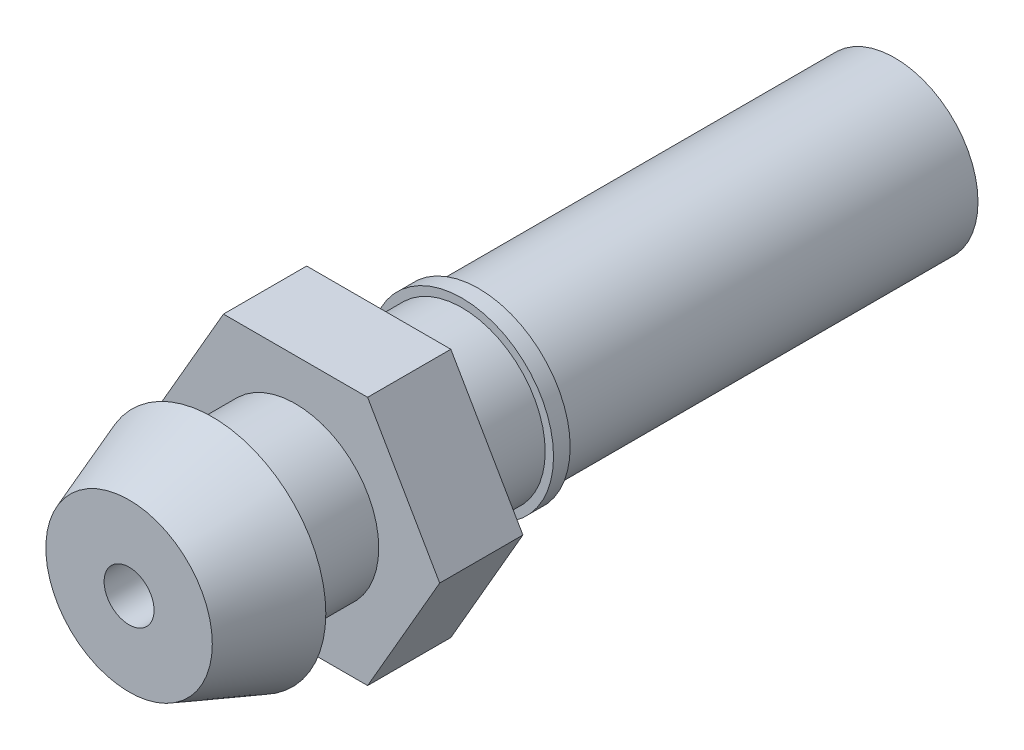
ISO-10303-21;
HEADER;
FILE_DESCRIPTION(('STEP AP214'),'2;1');
FILE_NAME('part.step','',(''),(''),'','','');
FILE_SCHEMA(('AUTOMOTIVE_DESIGN { 1 0 10303 214 1 1 1 1 }'));
ENDSEC;
DATA;
#1=APPLICATION_CONTEXT('core data for automotive mechanical design processes');
#2=APPLICATION_PROTOCOL_DEFINITION('international standard','automotive_design',2000,#1);
#3=PRODUCT_CONTEXT('',#1,'mechanical');
#4=PRODUCT('Part','Part','',(#3));
#5=PRODUCT_RELATED_PRODUCT_CATEGORY('part','',(#4));
#6=PRODUCT_DEFINITION_FORMATION('','',#4);
#7=PRODUCT_DEFINITION_CONTEXT('part definition',#1,'design');
#8=PRODUCT_DEFINITION('design','',#6,#7);
#9=PRODUCT_DEFINITION_SHAPE('','',#8);
#10=(LENGTH_UNIT() NAMED_UNIT(*) SI_UNIT(.MILLI.,.METRE.));
#11=(NAMED_UNIT(*) PLANE_ANGLE_UNIT() SI_UNIT($,.RADIAN.));
#12=(NAMED_UNIT(*) SI_UNIT($,.STERADIAN.) SOLID_ANGLE_UNIT());
#13=UNCERTAINTY_MEASURE_WITH_UNIT(LENGTH_MEASURE(1.E-05),#10,'distance_accuracy_value','');
#14=(GEOMETRIC_REPRESENTATION_CONTEXT(3) GLOBAL_UNCERTAINTY_ASSIGNED_CONTEXT((#13)) GLOBAL_UNIT_ASSIGNED_CONTEXT((#10,
#11,#12)) REPRESENTATION_CONTEXT('',''));
#15=CARTESIAN_POINT('',(0.,0.,0.));
#16=DIRECTION('',(0.,0.,1.));
#17=DIRECTION('',(1.,0.,0.));
#18=AXIS2_PLACEMENT_3D('',#15,#16,#17);
#19=CARTESIAN_POINT('',(0.,0.,11.684));
#20=DIRECTION('',(0.,0.,-1.));
#21=DIRECTION('',(1.,0.,0.));
#22=AXIS2_PLACEMENT_3D('',#19,#20,#21);
#23=CONICAL_SURFACE('',#22,1.27,0.349065850398867);
#24=CARTESIAN_POINT('',(0.,0.,11.684));
#25=DIRECTION('',(0.,0.,1.));
#26=DIRECTION('',(1.,0.,0.));
#27=AXIS2_PLACEMENT_3D('',#24,#25,#26);
#28=CIRCLE('',#27,1.27);
#29=CARTESIAN_POINT('',(1.27,0.,11.684));
#30=VERTEX_POINT('',#29);
#31=EDGE_CURVE('E11',#30,#30,#28,.T.);
#32=ORIENTED_EDGE('',*,*,#31,.F.);
#33=EDGE_LOOP('',(#32));
#34=FACE_BOUND('',#33,.T.);
#35=CARTESIAN_POINT('',(0.,0.,10.414));
#36=DIRECTION('',(0.,0.,1.));
#37=DIRECTION('',(1.,0.,0.));
#38=AXIS2_PLACEMENT_3D('',#35,#36,#37);
#39=CIRCLE('',#38,1.73224219751808);
#40=CARTESIAN_POINT('',(1.73224219751808,0.,10.414));
#41=VERTEX_POINT('',#40);
#42=EDGE_CURVE('E51',#41,#41,#39,.T.);
#43=ORIENTED_EDGE('',*,*,#42,.T.);
#44=EDGE_LOOP('',(#43));
#45=FACE_BOUND('',#44,.T.);
#46=ADVANCED_FACE('F44',(#34,#45),#23,.T.);
#47=CARTESIAN_POINT('',(0.,0.,11.684));
#48=DIRECTION('',(0.,0.,1.));
#49=DIRECTION('',(1.,0.,0.));
#50=AXIS2_PLACEMENT_3D('',#47,#48,#49);
#51=PLANE('',#50);
#52=CARTESIAN_POINT('',(0.,0.,11.684));
#53=DIRECTION('',(0.,0.,1.));
#54=DIRECTION('',(1.,0.,0.));
#55=AXIS2_PLACEMENT_3D('',#52,#53,#54);
#56=CIRCLE('',#55,0.381);
#57=CARTESIAN_POINT('',(0.381,0.,11.684));
#58=VERTEX_POINT('',#57);
#59=EDGE_CURVE('E57',#58,#58,#56,.T.);
#60=ORIENTED_EDGE('',*,*,#59,.F.);
#61=EDGE_LOOP('',(#60));
#62=FACE_BOUND('',#61,.T.);
#63=ORIENTED_EDGE('',*,*,#31,.T.);
#64=EDGE_LOOP('',(#63));
#65=FACE_BOUND('',#64,.T.);
#66=ADVANCED_FACE('F73',(#62,#65),#51,.T.);
#67=CARTESIAN_POINT('',(0.,0.,10.414));
#68=DIRECTION('',(0.,0.,1.));
#69=DIRECTION('',(1.,0.,0.));
#70=AXIS2_PLACEMENT_3D('',#67,#68,#69);
#71=PLANE('',#70);
#72=CARTESIAN_POINT('',(0.,0.,10.414));
#73=DIRECTION('',(0.,0.,1.));
#74=DIRECTION('',(1.,0.,0.));
#75=AXIS2_PLACEMENT_3D('',#72,#73,#74);
#76=CIRCLE('',#75,0.381);
#77=CARTESIAN_POINT('',(0.381,0.,10.414));
#78=VERTEX_POINT('',#77);
#79=EDGE_CURVE('E47',#78,#78,#76,.T.);
#80=ORIENTED_EDGE('',*,*,#79,.T.);
#81=EDGE_LOOP('',(#80));
#82=FACE_BOUND('',#81,.T.);
#83=ORIENTED_EDGE('',*,*,#42,.F.);
#84=EDGE_LOOP('',(#83));
#85=FACE_BOUND('',#84,.T.);
#86=ADVANCED_FACE('F64',(#82,#85),#71,.F.);
#87=CARTESIAN_POINT('',(0.,0.,0.));
#88=DIRECTION('',(0.,0.,1.));
#89=DIRECTION('',(1.,0.,0.));
#90=AXIS2_PLACEMENT_3D('',#87,#88,#89);
#91=CYLINDRICAL_SURFACE('',#90,0.381);
#92=ORIENTED_EDGE('',*,*,#59,.T.);
#93=EDGE_LOOP('',(#92));
#94=FACE_BOUND('',#93,.T.);
#95=ORIENTED_EDGE('',*,*,#79,.F.);
#96=EDGE_LOOP('',(#95));
#97=FACE_BOUND('',#96,.T.);
#98=ADVANCED_FACE('F67',(#94,#97),#91,.F.);
#99=CLOSED_SHELL('',(#46,#66,#86,#98));
#100=MANIFOLD_SOLID_BREP('B2',#99);
#101=CARTESIAN_POINT('',(0.,0.,9.144));
#102=DIRECTION('',(0.,0.,1.));
#103=DIRECTION('',(1.,0.,0.));
#104=AXIS2_PLACEMENT_3D('',#101,#102,#103);
#105=PLANE('',#104);
#106=DIRECTION('',(0.5,0.866025403784439,0.));
#107=VECTOR('',#106,1.);
#108=CARTESIAN_POINT('',(1.09985226280624,-1.905,9.144));
#109=LINE('',#108,#107);
#110=CARTESIAN_POINT('',(1.09985226280624,-1.905,9.144));
#111=VERTEX_POINT('',#110);
#112=CARTESIAN_POINT('',(2.19970452561247,0.,9.144));
#113=VERTEX_POINT('',#112);
#114=EDGE_CURVE('E204',#111,#113,#109,.T.);
#115=ORIENTED_EDGE('',*,*,#114,.T.);
#116=DIRECTION('',(-0.5,0.866025403784439,0.));
#117=VECTOR('',#116,1.);
#118=CARTESIAN_POINT('',(2.19970452561247,0.,9.144));
#119=LINE('',#118,#117);
#120=CARTESIAN_POINT('',(1.09985226280624,1.905,9.144));
#121=VERTEX_POINT('',#120);
#122=EDGE_CURVE('E162',#113,#121,#119,.T.);
#123=ORIENTED_EDGE('',*,*,#122,.T.);
#124=DIRECTION('',(-1.,0.,0.));
#125=VECTOR('',#124,1.);
#126=CARTESIAN_POINT('',(1.09985226280624,1.905,9.144));
#127=LINE('',#126,#125);
#128=CARTESIAN_POINT('',(-1.09985226280624,1.905,9.144));
#129=VERTEX_POINT('',#128);
#130=EDGE_CURVE('E175',#121,#129,#127,.T.);
#131=ORIENTED_EDGE('',*,*,#130,.T.);
#132=DIRECTION('',(-0.5,-0.866025403784439,0.));
#133=VECTOR('',#132,1.);
#134=CARTESIAN_POINT('',(-1.09985226280624,1.905,9.144));
#135=LINE('',#134,#133);
#136=CARTESIAN_POINT('',(-2.19970452561247,0.,9.144));
#137=VERTEX_POINT('',#136);
#138=EDGE_CURVE('E169',#129,#137,#135,.T.);
#139=ORIENTED_EDGE('',*,*,#138,.T.);
#140=DIRECTION('',(0.5,-0.866025403784439,0.));
#141=VECTOR('',#140,1.);
#142=CARTESIAN_POINT('',(-2.19970452561247,0.,9.144));
#143=LINE('',#142,#141);
#144=CARTESIAN_POINT('',(-1.09985226280624,-1.905,9.144));
#145=VERTEX_POINT('',#144);
#146=EDGE_CURVE('E173',#137,#145,#143,.T.);
#147=ORIENTED_EDGE('',*,*,#146,.T.);
#148=DIRECTION('',(1.,0.,0.));
#149=VECTOR('',#148,1.);
#150=CARTESIAN_POINT('',(-1.09985226280624,-1.905,9.144));
#151=LINE('',#150,#149);
#152=EDGE_CURVE('E124',#145,#111,#151,.T.);
#153=ORIENTED_EDGE('',*,*,#152,.T.);
#154=EDGE_LOOP('',(#115,#123,#131,#139,#147,#153));
#155=FACE_BOUND('',#154,.T.);
#156=CARTESIAN_POINT('',(0.,0.,9.144));
#157=DIRECTION('',(0.,0.,1.));
#158=DIRECTION('',(1.,0.,0.));
#159=AXIS2_PLACEMENT_3D('',#156,#157,#158);
#160=CIRCLE('',#159,1.27);
#161=CARTESIAN_POINT('',(1.27,0.,9.144));
#162=VERTEX_POINT('',#161);
#163=EDGE_CURVE('E402',#162,#162,#160,.T.);
#164=ORIENTED_EDGE('',*,*,#163,.F.);
#165=EDGE_LOOP('',(#164));
#166=FACE_BOUND('',#165,.T.);
#167=ADVANCED_FACE('F105',(#155,#166),#105,.T.);
#168=CARTESIAN_POINT('',(0.,0.,6.604));
#169=DIRECTION('',(0.,0.,1.));
#170=DIRECTION('',(1.,0.,0.));
#171=AXIS2_PLACEMENT_3D('',#168,#169,#170);
#172=PLANE('',#171);
#173=CARTESIAN_POINT('',(0.,0.,6.604));
#174=DIRECTION('',(0.,0.,1.));
#175=DIRECTION('',(1.,0.,0.));
#176=AXIS2_PLACEMENT_3D('',#173,#174,#175);
#177=CIRCLE('',#176,1.397);
#178=CARTESIAN_POINT('',(1.397,0.,6.604));
#179=VERTEX_POINT('',#178);
#180=EDGE_CURVE('E220',#179,#179,#177,.T.);
#181=ORIENTED_EDGE('',*,*,#180,.T.);
#182=EDGE_LOOP('',(#181));
#183=FACE_BOUND('',#182,.T.);
#184=CARTESIAN_POINT('',(0.,0.,6.604));
#185=DIRECTION('',(0.,0.,1.));
#186=DIRECTION('',(1.,0.,0.));
#187=AXIS2_PLACEMENT_3D('',#184,#185,#186);
#188=CIRCLE('',#187,1.27);
#189=CARTESIAN_POINT('',(1.27,0.,6.604));
#190=VERTEX_POINT('',#189);
#191=EDGE_CURVE('E213',#190,#190,#188,.T.);
#192=ORIENTED_EDGE('',*,*,#191,.F.);
#193=EDGE_LOOP('',(#192));
#194=FACE_BOUND('',#193,.T.);
#195=ADVANCED_FACE('F239',(#183,#194),#172,.T.);
#196=CARTESIAN_POINT('',(0.,0.,6.35));
#197=DIRECTION('',(0.,0.,-1.));
#198=DIRECTION('',(-1.,0.,0.));
#199=AXIS2_PLACEMENT_3D('',#196,#197,#198);
#200=CYLINDRICAL_SURFACE('',#199,1.27);
#201=CARTESIAN_POINT('',(0.,0.,6.35));
#202=DIRECTION('',(0.,0.,1.));
#203=DIRECTION('',(1.,0.,0.));
#204=AXIS2_PLACEMENT_3D('',#201,#202,#203);
#205=CIRCLE('',#204,1.27);
#206=CARTESIAN_POINT('',(1.27,0.,6.35));
#207=VERTEX_POINT('',#206);
#208=EDGE_CURVE('E42',#207,#207,#205,.T.);
#209=ORIENTED_EDGE('',*,*,#208,.F.);
#210=EDGE_LOOP('',(#209));
#211=FACE_BOUND('',#210,.T.);
#212=CARTESIAN_POINT('',(0.,0.,0.));
#213=DIRECTION('',(0.,0.,1.));
#214=DIRECTION('',(1.,0.,0.));
#215=AXIS2_PLACEMENT_3D('',#212,#213,#214);
#216=CIRCLE('',#215,1.27);
#217=CARTESIAN_POINT('',(1.27,0.,0.));
#218=VERTEX_POINT('',#217);
#219=EDGE_CURVE('E115',#218,#218,#216,.T.);
#220=ORIENTED_EDGE('',*,*,#219,.T.);
#221=EDGE_LOOP('',(#220));
#222=FACE_BOUND('',#221,.T.);
#223=ADVANCED_FACE('F107',(#211,#222),#200,.T.);
#224=CARTESIAN_POINT('',(0.,0.,0.));
#225=DIRECTION('',(0.,0.,1.));
#226=DIRECTION('',(1.,0.,0.));
#227=AXIS2_PLACEMENT_3D('',#224,#225,#226);
#228=PLANE('',#227);
#229=CARTESIAN_POINT('',(0.,0.,0.));
#230=DIRECTION('',(0.,0.,1.));
#231=DIRECTION('',(1.,0.,0.));
#232=AXIS2_PLACEMENT_3D('',#229,#230,#231);
#233=CIRCLE('',#232,0.381);
#234=CARTESIAN_POINT('',(0.381,0.,0.));
#235=VERTEX_POINT('',#234);
#236=EDGE_CURVE('E400',#235,#235,#233,.T.);
#237=ORIENTED_EDGE('',*,*,#236,.T.);
#238=EDGE_LOOP('',(#237));
#239=FACE_BOUND('',#238,.T.);
#240=ORIENTED_EDGE('',*,*,#219,.F.);
#241=EDGE_LOOP('',(#240));
#242=FACE_BOUND('',#241,.T.);
#243=ADVANCED_FACE('F228',(#239,#242),#228,.F.);
#244=CARTESIAN_POINT('',(0.,0.,6.35));
#245=DIRECTION('',(0.,0.,1.));
#246=DIRECTION('',(1.,0.,0.));
#247=AXIS2_PLACEMENT_3D('',#244,#245,#246);
#248=PLANE('',#247);
#249=CARTESIAN_POINT('',(0.,0.,6.35));
#250=DIRECTION('',(0.,0.,1.));
#251=DIRECTION('',(1.,0.,0.));
#252=AXIS2_PLACEMENT_3D('',#249,#250,#251);
#253=CIRCLE('',#252,1.397);
#254=CARTESIAN_POINT('',(1.397,0.,6.35));
#255=VERTEX_POINT('',#254);
#256=EDGE_CURVE('E217',#255,#255,#253,.T.);
#257=ORIENTED_EDGE('',*,*,#256,.F.);
#258=EDGE_LOOP('',(#257));
#259=FACE_BOUND('',#258,.T.);
#260=ORIENTED_EDGE('',*,*,#208,.T.);
#261=EDGE_LOOP('',(#260));
#262=FACE_BOUND('',#261,.T.);
#263=ADVANCED_FACE('F230',(#259,#262),#248,.F.);
#264=CARTESIAN_POINT('',(0.,0.,6.604));
#265=DIRECTION('',(0.,0.,-1.));
#266=DIRECTION('',(-1.,0.,0.));
#267=AXIS2_PLACEMENT_3D('',#264,#265,#266);
#268=CYLINDRICAL_SURFACE('',#267,1.397);
#269=ORIENTED_EDGE('',*,*,#180,.F.);
#270=EDGE_LOOP('',(#269));
#271=FACE_BOUND('',#270,.T.);
#272=ORIENTED_EDGE('',*,*,#256,.T.);
#273=EDGE_LOOP('',(#272));
#274=FACE_BOUND('',#273,.T.);
#275=ADVANCED_FACE('F236',(#271,#274),#268,.T.);
#276=CARTESIAN_POINT('',(0.,0.,7.874));
#277=DIRECTION('',(0.,0.,-1.));
#278=DIRECTION('',(-1.,0.,0.));
#279=AXIS2_PLACEMENT_3D('',#276,#277,#278);
#280=CYLINDRICAL_SURFACE('',#279,1.27);
#281=CARTESIAN_POINT('',(0.,0.,7.874));
#282=DIRECTION('',(0.,0.,1.));
#283=DIRECTION('',(1.,0.,0.));
#284=AXIS2_PLACEMENT_3D('',#281,#282,#283);
#285=CIRCLE('',#284,1.27);
#286=CARTESIAN_POINT('',(1.27,0.,7.874));
#287=VERTEX_POINT('',#286);
#288=EDGE_CURVE('E214',#287,#287,#285,.T.);
#289=ORIENTED_EDGE('',*,*,#288,.F.);
#290=EDGE_LOOP('',(#289));
#291=FACE_BOUND('',#290,.T.);
#292=ORIENTED_EDGE('',*,*,#191,.T.);
#293=EDGE_LOOP('',(#292));
#294=FACE_BOUND('',#293,.T.);
#295=ADVANCED_FACE('F258',(#291,#294),#280,.T.);
#296=CARTESIAN_POINT('',(0.,0.,7.874));
#297=DIRECTION('',(0.,0.,1.));
#298=DIRECTION('',(1.,0.,0.));
#299=AXIS2_PLACEMENT_3D('',#296,#297,#298);
#300=PLANE('',#299);
#301=DIRECTION('',(0.5,0.866025403784439,0.));
#302=VECTOR('',#301,1.);
#303=CARTESIAN_POINT('',(1.09985226280624,-1.905,7.874));
#304=LINE('',#303,#302);
#305=CARTESIAN_POINT('',(1.09985226280624,-1.905,7.874));
#306=VERTEX_POINT('',#305);
#307=CARTESIAN_POINT('',(2.19970452561247,0.,7.874));
#308=VERTEX_POINT('',#307);
#309=EDGE_CURVE('E193',#306,#308,#304,.T.);
#310=ORIENTED_EDGE('',*,*,#309,.F.);
#311=DIRECTION('',(1.,0.,0.));
#312=VECTOR('',#311,1.);
#313=CARTESIAN_POINT('',(-1.09985226280624,-1.905,7.874));
#314=LINE('',#313,#312);
#315=CARTESIAN_POINT('',(-1.09985226280624,-1.905,7.874));
#316=VERTEX_POINT('',#315);
#317=EDGE_CURVE('E153',#316,#306,#314,.T.);
#318=ORIENTED_EDGE('',*,*,#317,.F.);
#319=DIRECTION('',(0.5,-0.866025403784439,0.));
#320=VECTOR('',#319,1.);
#321=CARTESIAN_POINT('',(-2.19970452561247,0.,7.874));
#322=LINE('',#321,#320);
#323=CARTESIAN_POINT('',(-2.19970452561247,0.,7.874));
#324=VERTEX_POINT('',#323);
#325=EDGE_CURVE('E147',#324,#316,#322,.T.);
#326=ORIENTED_EDGE('',*,*,#325,.F.);
#327=DIRECTION('',(-0.5,-0.866025403784439,0.));
#328=VECTOR('',#327,1.);
#329=CARTESIAN_POINT('',(-1.09985226280624,1.905,7.874));
#330=LINE('',#329,#328);
#331=CARTESIAN_POINT('',(-1.09985226280624,1.905,7.874));
#332=VERTEX_POINT('',#331);
#333=EDGE_CURVE('E183',#332,#324,#330,.T.);
#334=ORIENTED_EDGE('',*,*,#333,.F.);
#335=DIRECTION('',(-1.,0.,0.));
#336=VECTOR('',#335,1.);
#337=CARTESIAN_POINT('',(1.09985226280624,1.905,7.874));
#338=LINE('',#337,#336);
#339=CARTESIAN_POINT('',(1.09985226280624,1.905,7.874));
#340=VERTEX_POINT('',#339);
#341=EDGE_CURVE('E199',#340,#332,#338,.T.);
#342=ORIENTED_EDGE('',*,*,#341,.F.);
#343=DIRECTION('',(-0.5,0.866025403784439,0.));
#344=VECTOR('',#343,1.);
#345=CARTESIAN_POINT('',(2.19970452561247,0.,7.874));
#346=LINE('',#345,#344);
#347=EDGE_CURVE('E196',#308,#340,#346,.T.);
#348=ORIENTED_EDGE('',*,*,#347,.F.);
#349=EDGE_LOOP('',(#310,#318,#326,#334,#342,#348));
#350=FACE_BOUND('',#349,.T.);
#351=ORIENTED_EDGE('',*,*,#288,.T.);
#352=EDGE_LOOP('',(#351));
#353=FACE_BOUND('',#352,.T.);
#354=ADVANCED_FACE('F254',(#350,#353),#300,.F.);
#355=CARTESIAN_POINT('',(1.09985226280624,-1.905,9.144));
#356=DIRECTION('',(-0.866025403784439,0.5,0.));
#357=DIRECTION('',(-0.5,-0.866025403784439,0.));
#358=AXIS2_PLACEMENT_3D('',#355,#356,#357);
#359=PLANE('',#358);
#360=ORIENTED_EDGE('',*,*,#309,.T.);
#361=DIRECTION('',(0.,0.,-1.));
#362=VECTOR('',#361,1.);
#363=CARTESIAN_POINT('',(2.19970452561247,0.,9.144));
#364=LINE('',#363,#362);
#365=EDGE_CURVE('E211',#113,#308,#364,.T.);
#366=ORIENTED_EDGE('',*,*,#365,.F.);
#367=ORIENTED_EDGE('',*,*,#114,.F.);
#368=DIRECTION('',(0.,0.,-1.));
#369=VECTOR('',#368,1.);
#370=CARTESIAN_POINT('',(1.09985226280624,-1.905,9.144));
#371=LINE('',#370,#369);
#372=EDGE_CURVE('E189',#111,#306,#371,.T.);
#373=ORIENTED_EDGE('',*,*,#372,.T.);
#374=EDGE_LOOP('',(#360,#366,#367,#373));
#375=FACE_BOUND('',#374,.T.);
#376=ADVANCED_FACE('F257',(#375),#359,.F.);
#377=CARTESIAN_POINT('',(2.19970452561247,0.,9.144));
#378=DIRECTION('',(-0.866025403784438,-0.5,0.));
#379=DIRECTION('',(0.5,-0.866025403784439,0.));
#380=AXIS2_PLACEMENT_3D('',#377,#378,#379);
#381=PLANE('',#380);
#382=ORIENTED_EDGE('',*,*,#347,.T.);
#383=DIRECTION('',(0.,0.,-1.));
#384=VECTOR('',#383,1.);
#385=CARTESIAN_POINT('',(1.09985226280624,1.905,9.144));
#386=LINE('',#385,#384);
#387=EDGE_CURVE('E208',#121,#340,#386,.T.);
#388=ORIENTED_EDGE('',*,*,#387,.F.);
#389=ORIENTED_EDGE('',*,*,#122,.F.);
#390=ORIENTED_EDGE('',*,*,#365,.T.);
#391=EDGE_LOOP('',(#382,#388,#389,#390));
#392=FACE_BOUND('',#391,.T.);
#393=ADVANCED_FACE('F270',(#392),#381,.F.);
#394=CARTESIAN_POINT('',(1.09985226280624,1.905,9.144));
#395=DIRECTION('',(0.,-1.,0.));
#396=DIRECTION('',(1.,0.,0.));
#397=AXIS2_PLACEMENT_3D('',#394,#395,#396);
#398=PLANE('',#397);
#399=ORIENTED_EDGE('',*,*,#341,.T.);
#400=DIRECTION('',(0.,0.,-1.));
#401=VECTOR('',#400,1.);
#402=CARTESIAN_POINT('',(-1.09985226280624,1.905,9.144));
#403=LINE('',#402,#401);
#404=EDGE_CURVE('E184',#129,#332,#403,.T.);
#405=ORIENTED_EDGE('',*,*,#404,.F.);
#406=ORIENTED_EDGE('',*,*,#130,.F.);
#407=ORIENTED_EDGE('',*,*,#387,.T.);
#408=EDGE_LOOP('',(#399,#405,#406,#407));
#409=FACE_BOUND('',#408,.T.);
#410=ADVANCED_FACE('F267',(#409),#398,.F.);
#411=CARTESIAN_POINT('',(-1.09985226280624,1.905,9.144));
#412=DIRECTION('',(0.866025403784439,-0.5,0.));
#413=DIRECTION('',(0.5,0.866025403784439,0.));
#414=AXIS2_PLACEMENT_3D('',#411,#412,#413);
#415=PLANE('',#414);
#416=ORIENTED_EDGE('',*,*,#333,.T.);
#417=DIRECTION('',(0.,0.,-1.));
#418=VECTOR('',#417,1.);
#419=CARTESIAN_POINT('',(-2.19970452561247,0.,9.144));
#420=LINE('',#419,#418);
#421=EDGE_CURVE('E180',#137,#324,#420,.T.);
#422=ORIENTED_EDGE('',*,*,#421,.F.);
#423=ORIENTED_EDGE('',*,*,#138,.F.);
#424=ORIENTED_EDGE('',*,*,#404,.T.);
#425=EDGE_LOOP('',(#416,#422,#423,#424));
#426=FACE_BOUND('',#425,.T.);
#427=ADVANCED_FACE('F181',(#426),#415,.F.);
#428=CARTESIAN_POINT('',(-2.19970452561247,0.,9.144));
#429=DIRECTION('',(0.866025403784439,0.5,0.));
#430=DIRECTION('',(-0.5,0.866025403784439,0.));
#431=AXIS2_PLACEMENT_3D('',#428,#429,#430);
#432=PLANE('',#431);
#433=ORIENTED_EDGE('',*,*,#325,.T.);
#434=DIRECTION('',(0.,0.,-1.));
#435=VECTOR('',#434,1.);
#436=CARTESIAN_POINT('',(-1.09985226280624,-1.905,9.144));
#437=LINE('',#436,#435);
#438=EDGE_CURVE('E185',#145,#316,#437,.T.);
#439=ORIENTED_EDGE('',*,*,#438,.F.);
#440=ORIENTED_EDGE('',*,*,#146,.F.);
#441=ORIENTED_EDGE('',*,*,#421,.T.);
#442=EDGE_LOOP('',(#433,#439,#440,#441));
#443=FACE_BOUND('',#442,.T.);
#444=ADVANCED_FACE('F187',(#443),#432,.F.);
#445=CARTESIAN_POINT('',(-1.09985226280624,-1.905,9.144));
#446=DIRECTION('',(0.,1.,0.));
#447=DIRECTION('',(0.,0.,1.));
#448=AXIS2_PLACEMENT_3D('',#445,#446,#447);
#449=PLANE('',#448);
#450=ORIENTED_EDGE('',*,*,#317,.T.);
#451=ORIENTED_EDGE('',*,*,#372,.F.);
#452=ORIENTED_EDGE('',*,*,#152,.F.);
#453=ORIENTED_EDGE('',*,*,#438,.T.);
#454=EDGE_LOOP('',(#450,#451,#452,#453));
#455=FACE_BOUND('',#454,.T.);
#456=ADVANCED_FACE('F260',(#455),#449,.F.);
#457=CARTESIAN_POINT('',(0.,0.,10.414));
#458=DIRECTION('',(0.,0.,-1.));
#459=DIRECTION('',(-1.,0.,0.));
#460=AXIS2_PLACEMENT_3D('',#457,#458,#459);
#461=CYLINDRICAL_SURFACE('',#460,1.27);
#462=CARTESIAN_POINT('',(0.,0.,10.414));
#463=DIRECTION('',(0.,0.,1.));
#464=DIRECTION('',(1.,0.,0.));
#465=AXIS2_PLACEMENT_3D('',#462,#463,#464);
#466=CIRCLE('',#465,1.27);
#467=CARTESIAN_POINT('',(1.27,0.,10.414));
#468=VERTEX_POINT('',#467);
#469=EDGE_CURVE('E197',#468,#468,#466,.T.);
#470=ORIENTED_EDGE('',*,*,#469,.F.);
#471=EDGE_LOOP('',(#470));
#472=FACE_BOUND('',#471,.T.);
#473=ORIENTED_EDGE('',*,*,#163,.T.);
#474=EDGE_LOOP('',(#473));
#475=FACE_BOUND('',#474,.T.);
#476=ADVANCED_FACE('F252',(#472,#475),#461,.T.);
#477=CARTESIAN_POINT('',(0.,0.,10.414));
#478=DIRECTION('',(0.,0.,1.));
#479=DIRECTION('',(1.,0.,0.));
#480=AXIS2_PLACEMENT_3D('',#477,#478,#479);
#481=PLANE('',#480);
#482=CARTESIAN_POINT('',(0.,0.,10.414));
#483=DIRECTION('',(0.,0.,1.));
#484=DIRECTION('',(1.,0.,0.));
#485=AXIS2_PLACEMENT_3D('',#482,#483,#484);
#486=CIRCLE('',#485,0.381);
#487=CARTESIAN_POINT('',(0.381,0.,10.414));
#488=VERTEX_POINT('',#487);
#489=EDGE_CURVE('E109',#488,#488,#486,.T.);
#490=ORIENTED_EDGE('',*,*,#489,.F.);
#491=EDGE_LOOP('',(#490));
#492=FACE_BOUND('',#491,.T.);
#493=ORIENTED_EDGE('',*,*,#469,.T.);
#494=EDGE_LOOP('',(#493));
#495=FACE_BOUND('',#494,.T.);
#496=ADVANCED_FACE('F332',(#492,#495),#481,.T.);
#497=CARTESIAN_POINT('',(0.,0.,0.));
#498=DIRECTION('',(0.,0.,1.));
#499=DIRECTION('',(1.,0.,0.));
#500=AXIS2_PLACEMENT_3D('',#497,#498,#499);
#501=CYLINDRICAL_SURFACE('',#500,0.381);
#502=ORIENTED_EDGE('',*,*,#489,.T.);
#503=EDGE_LOOP('',(#502));
#504=FACE_BOUND('',#503,.T.);
#505=ORIENTED_EDGE('',*,*,#236,.F.);
#506=EDGE_LOOP('',(#505));
#507=FACE_BOUND('',#506,.T.);
#508=ADVANCED_FACE('F339',(#504,#507),#501,.F.);
#509=CLOSED_SHELL('',(#167,#195,#223,#243,#263,#275,#295,#354,#376,#393,#410,#427,#444,#456,
#476,#496,#508));
#510=MANIFOLD_SOLID_BREP('B6',#509);
#511=ADVANCED_BREP_SHAPE_REPRESENTATION('',(#18,#100,#510),#14);
#512=SHAPE_DEFINITION_REPRESENTATION(#9,#511);
ENDSEC;
END-ISO-10303-21;
